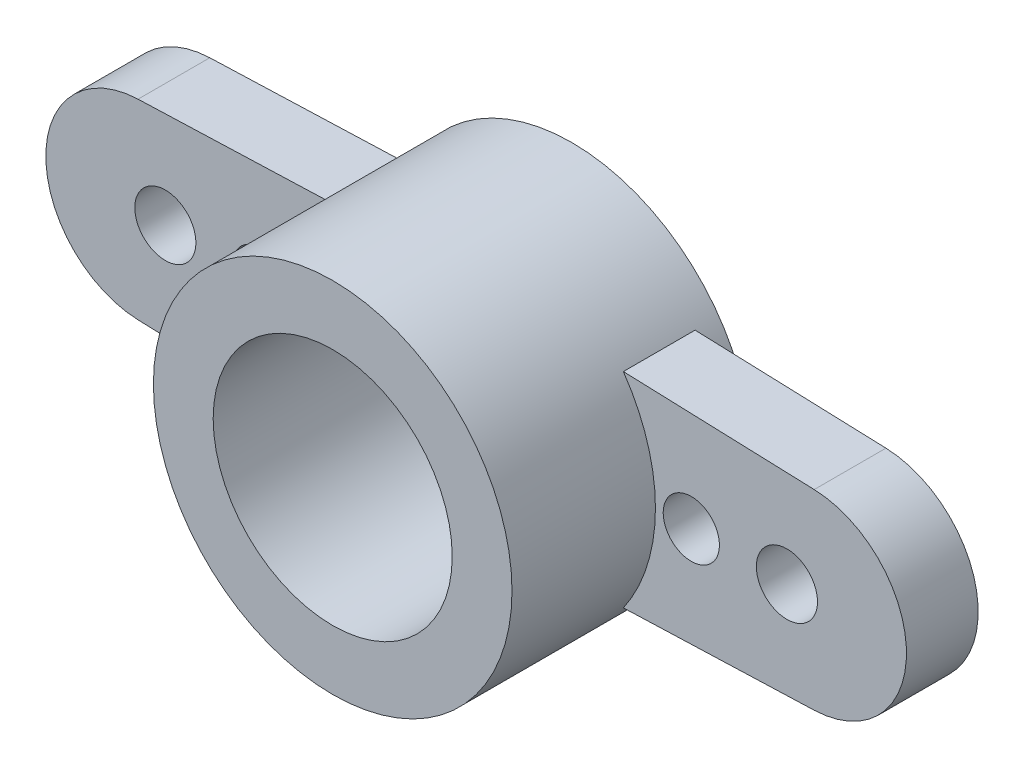
ISO-10303-21;
HEADER;
FILE_DESCRIPTION(('STEP AP214'),'2;1');
FILE_NAME('part.step','',(''),(''),'','','');
FILE_SCHEMA(('AUTOMOTIVE_DESIGN { 1 0 10303 214 1 1 1 1 }'));
ENDSEC;
DATA;
#1=APPLICATION_CONTEXT('core data for automotive mechanical design processes');
#2=APPLICATION_PROTOCOL_DEFINITION('international standard','automotive_design',2000,#1);
#3=PRODUCT_CONTEXT('',#1,'mechanical');
#4=PRODUCT('Part','Part','',(#3));
#5=PRODUCT_RELATED_PRODUCT_CATEGORY('part','',(#4));
#6=PRODUCT_DEFINITION_FORMATION('','',#4);
#7=PRODUCT_DEFINITION_CONTEXT('part definition',#1,'design');
#8=PRODUCT_DEFINITION('design','',#6,#7);
#9=PRODUCT_DEFINITION_SHAPE('','',#8);
#10=(LENGTH_UNIT() NAMED_UNIT(*) SI_UNIT(.MILLI.,.METRE.));
#11=(NAMED_UNIT(*) PLANE_ANGLE_UNIT() SI_UNIT($,.RADIAN.));
#12=(NAMED_UNIT(*) SI_UNIT($,.STERADIAN.) SOLID_ANGLE_UNIT());
#13=UNCERTAINTY_MEASURE_WITH_UNIT(LENGTH_MEASURE(1.E-05),#10,'distance_accuracy_value','');
#14=(GEOMETRIC_REPRESENTATION_CONTEXT(3) GLOBAL_UNCERTAINTY_ASSIGNED_CONTEXT((#13)) GLOBAL_UNIT_ASSIGNED_CONTEXT((#10,
#11,#12)) REPRESENTATION_CONTEXT('',''));
#15=CARTESIAN_POINT('',(0.,0.,0.));
#16=DIRECTION('',(0.,0.,1.));
#17=DIRECTION('',(1.,0.,0.));
#18=AXIS2_PLACEMENT_3D('',#15,#16,#17);
#19=CARTESIAN_POINT('',(0.,0.,1.5));
#20=DIRECTION('',(0.,0.,-1.));
#21=DIRECTION('',(-1.,0.,0.));
#22=AXIS2_PLACEMENT_3D('',#19,#20,#21);
#23=CYLINDRICAL_SURFACE('',#22,3.75);
#24=DIRECTION('',(0.,0.,-1.));
#25=VECTOR('',#24,1.);
#26=CARTESIAN_POINT('',(3.07929983171955,-2.14018983886289,1.5));
#27=LINE('',#26,#25);
#28=CARTESIAN_POINT('',(3.07929983171955,-2.14018983886289,1.5));
#29=VERTEX_POINT('',#28);
#30=CARTESIAN_POINT('',(3.07929983171955,-2.14018983886289,0.));
#31=VERTEX_POINT('',#30);
#32=EDGE_CURVE('E59',#29,#31,#27,.T.);
#33=ORIENTED_EDGE('',*,*,#32,.F.);
#34=CARTESIAN_POINT('',(0.,0.,1.5));
#35=DIRECTION('',(0.,0.,1.));
#36=DIRECTION('',(-1.,0.,0.));
#37=AXIS2_PLACEMENT_3D('',#34,#35,#36);
#38=CIRCLE('',#37,3.75);
#39=CARTESIAN_POINT('',(3.07929983171955,2.14018983886289,1.5));
#40=VERTEX_POINT('',#39);
#41=EDGE_CURVE('E54',#29,#40,#38,.T.);
#42=ORIENTED_EDGE('',*,*,#41,.T.);
#43=DIRECTION('',(0.,0.,-1.));
#44=VECTOR('',#43,1.);
#45=CARTESIAN_POINT('',(3.07929983171955,2.14018983886289,1.5));
#46=LINE('',#45,#44);
#47=CARTESIAN_POINT('',(3.07929983171955,2.14018983886289,0.));
#48=VERTEX_POINT('',#47);
#49=EDGE_CURVE('E114',#40,#48,#46,.T.);
#50=ORIENTED_EDGE('',*,*,#49,.T.);
#51=CARTESIAN_POINT('',(0.,0.,0.));
#52=DIRECTION('',(0.,0.,1.));
#53=DIRECTION('',(-1.,0.,0.));
#54=AXIS2_PLACEMENT_3D('',#51,#52,#53);
#55=CIRCLE('',#54,3.75);
#56=EDGE_CURVE('E127',#31,#48,#55,.T.);
#57=ORIENTED_EDGE('',*,*,#56,.F.);
#58=EDGE_LOOP('',(#33,#42,#50,#57));
#59=FACE_BOUND('',#58,.T.);
#60=CARTESIAN_POINT('',(0.,0.,-0.5));
#61=DIRECTION('',(0.,0.,-1.));
#62=DIRECTION('',(-1.,0.,0.));
#63=AXIS2_PLACEMENT_3D('',#60,#61,#62);
#64=CIRCLE('',#63,3.75);
#65=CARTESIAN_POINT('',(-3.75,0.,-0.5));
#66=VERTEX_POINT('',#65);
#67=EDGE_CURVE('E11',#66,#66,#64,.T.);
#68=ORIENTED_EDGE('',*,*,#67,.F.);
#69=EDGE_LOOP('',(#68));
#70=FACE_BOUND('',#69,.T.);
#71=DIRECTION('',(0.,0.,-1.));
#72=VECTOR('',#71,1.);
#73=CARTESIAN_POINT('',(-3.07929983171955,-2.14018983886289,1.5));
#74=LINE('',#73,#72);
#75=CARTESIAN_POINT('',(-3.07929983171955,-2.14018983886289,1.5));
#76=VERTEX_POINT('',#75);
#77=CARTESIAN_POINT('',(-3.07929983171955,-2.14018983886289,0.));
#78=VERTEX_POINT('',#77);
#79=EDGE_CURVE('E170',#76,#78,#74,.T.);
#80=ORIENTED_EDGE('',*,*,#79,.T.);
#81=CARTESIAN_POINT('',(0.,0.,0.));
#82=DIRECTION('',(0.,0.,1.));
#83=DIRECTION('',(1.,0.,0.));
#84=AXIS2_PLACEMENT_3D('',#81,#82,#83);
#85=CIRCLE('',#84,3.75);
#86=CARTESIAN_POINT('',(-3.07929983171955,2.14018983886289,0.));
#87=VERTEX_POINT('',#86);
#88=EDGE_CURVE('E409',#87,#78,#85,.T.);
#89=ORIENTED_EDGE('',*,*,#88,.F.);
#90=DIRECTION('',(0.,0.,-1.));
#91=VECTOR('',#90,1.);
#92=CARTESIAN_POINT('',(-3.07929983171955,2.14018983886289,1.5));
#93=LINE('',#92,#91);
#94=CARTESIAN_POINT('',(-3.07929983171955,2.14018983886289,1.5));
#95=VERTEX_POINT('',#94);
#96=EDGE_CURVE('E168',#95,#87,#93,.T.);
#97=ORIENTED_EDGE('',*,*,#96,.F.);
#98=CARTESIAN_POINT('',(0.,0.,1.5));
#99=DIRECTION('',(0.,0.,1.));
#100=DIRECTION('',(1.,0.,0.));
#101=AXIS2_PLACEMENT_3D('',#98,#99,#100);
#102=CIRCLE('',#101,3.75);
#103=EDGE_CURVE('E155',#95,#76,#102,.T.);
#104=ORIENTED_EDGE('',*,*,#103,.T.);
#105=EDGE_LOOP('',(#80,#89,#97,#104));
#106=FACE_BOUND('',#105,.T.);
#107=CARTESIAN_POINT('',(0.,0.,4.5));
#108=DIRECTION('',(0.,0.,1.));
#109=DIRECTION('',(1.,0.,0.));
#110=AXIS2_PLACEMENT_3D('',#107,#108,#109);
#111=CIRCLE('',#110,3.75);
#112=CARTESIAN_POINT('',(3.75,0.,4.5));
#113=VERTEX_POINT('',#112);
#114=EDGE_CURVE('E156',#113,#113,#111,.T.);
#115=ORIENTED_EDGE('',*,*,#114,.F.);
#116=EDGE_LOOP('',(#115));
#117=FACE_BOUND('',#116,.T.);
#118=ADVANCED_FACE('F37',(#59,#70,#106,#117),#23,.T.);
#119=CARTESIAN_POINT('',(0.,0.,-0.5));
#120=DIRECTION('',(0.,0.,-1.));
#121=DIRECTION('',(-1.,0.,0.));
#122=AXIS2_PLACEMENT_3D('',#119,#120,#121);
#123=PLANE('',#122);
#124=ORIENTED_EDGE('',*,*,#67,.T.);
#125=EDGE_LOOP('',(#124));
#126=FACE_BOUND('',#125,.T.);
#127=CARTESIAN_POINT('',(0.,0.,-0.5));
#128=DIRECTION('',(0.,0.,-1.));
#129=DIRECTION('',(-1.,0.,0.));
#130=AXIS2_PLACEMENT_3D('',#127,#128,#129);
#131=CIRCLE('',#130,2.5);
#132=CARTESIAN_POINT('',(-2.5,0.,-0.5));
#133=VERTEX_POINT('',#132);
#134=EDGE_CURVE('E46',#133,#133,#131,.T.);
#135=ORIENTED_EDGE('',*,*,#134,.F.);
#136=EDGE_LOOP('',(#135));
#137=FACE_BOUND('',#136,.T.);
#138=ADVANCED_FACE('F223',(#126,#137),#123,.T.);
#139=CARTESIAN_POINT('',(0.,0.,1.5));
#140=DIRECTION('',(0.,0.,-1.));
#141=DIRECTION('',(-1.,0.,0.));
#142=AXIS2_PLACEMENT_3D('',#139,#140,#141);
#143=CYLINDRICAL_SURFACE('',#142,2.5);
#144=ORIENTED_EDGE('',*,*,#134,.T.);
#145=EDGE_LOOP('',(#144));
#146=FACE_BOUND('',#145,.T.);
#147=CARTESIAN_POINT('',(0.,0.,4.5));
#148=DIRECTION('',(0.,0.,1.));
#149=DIRECTION('',(1.,0.,0.));
#150=AXIS2_PLACEMENT_3D('',#147,#148,#149);
#151=CIRCLE('',#150,2.5);
#152=CARTESIAN_POINT('',(2.5,0.,4.5));
#153=VERTEX_POINT('',#152);
#154=EDGE_CURVE('E152',#153,#153,#151,.T.);
#155=ORIENTED_EDGE('',*,*,#154,.T.);
#156=EDGE_LOOP('',(#155));
#157=FACE_BOUND('',#156,.T.);
#158=ADVANCED_FACE('F39',(#146,#157),#143,.F.);
#159=CARTESIAN_POINT('',(0.,0.,1.5));
#160=DIRECTION('',(0.,0.,1.));
#161=DIRECTION('',(1.,0.,0.));
#162=AXIS2_PLACEMENT_3D('',#159,#160,#161);
#163=PLANE('',#162);
#164=CARTESIAN_POINT('',(-6.5,0.,1.5));
#165=DIRECTION('',(0.,0.,1.));
#166=DIRECTION('',(1.,0.,0.));
#167=AXIS2_PLACEMENT_3D('',#164,#165,#166);
#168=CIRCLE('',#167,0.638983791672923);
#169=CARTESIAN_POINT('',(-5.86101620832708,0.,1.5));
#170=VERTEX_POINT('',#169);
#171=EDGE_CURVE('E113',#170,#170,#168,.T.);
#172=ORIENTED_EDGE('',*,*,#171,.F.);
#173=EDGE_LOOP('',(#172));
#174=FACE_BOUND('',#173,.T.);
#175=CARTESIAN_POINT('',(-4.5,0.,1.5));
#176=DIRECTION('',(0.,0.,1.));
#177=DIRECTION('',(1.,0.,0.));
#178=AXIS2_PLACEMENT_3D('',#175,#176,#177);
#179=CIRCLE('',#178,0.587851578485882);
#180=CARTESIAN_POINT('',(-3.91214842151412,0.,1.5));
#181=VERTEX_POINT('',#180);
#182=EDGE_CURVE('E148',#181,#181,#179,.T.);
#183=ORIENTED_EDGE('',*,*,#182,.F.);
#184=EDGE_LOOP('',(#183));
#185=FACE_BOUND('',#184,.T.);
#186=ORIENTED_EDGE('',*,*,#103,.F.);
#187=DIRECTION('',(0.999372730394994,0.0354139201848025,0.));
#188=VECTOR('',#187,1.);
#189=CARTESIAN_POINT('',(-0.0796068605695939,2.24648740355352,1.5));
#190=LINE('',#189,#188);
#191=CARTESIAN_POINT('',(-7.07082784036961,1.99874546078999,1.5));
#192=VERTEX_POINT('',#191);
#193=EDGE_CURVE('E174',#192,#95,#190,.T.);
#194=ORIENTED_EDGE('',*,*,#193,.F.);
#195=CARTESIAN_POINT('',(-7.,0.,1.5));
#196=DIRECTION('',(0.,0.,1.));
#197=DIRECTION('',(1.,0.,0.));
#198=AXIS2_PLACEMENT_3D('',#195,#196,#197);
#199=CIRCLE('',#198,2.);
#200=CARTESIAN_POINT('',(-7.0708278403696,-1.99874546078999,1.5));
#201=VERTEX_POINT('',#200);
#202=EDGE_CURVE('E163',#201,#192,#199,.F.);
#203=ORIENTED_EDGE('',*,*,#202,.F.);
#204=DIRECTION('',(0.999372730394994,-0.0354139201848023,0.));
#205=VECTOR('',#204,1.);
#206=CARTESIAN_POINT('',(-0.0796068605695934,-2.24648740355352,1.5));
#207=LINE('',#206,#205);
#208=EDGE_CURVE('E177',#201,#76,#207,.T.);
#209=ORIENTED_EDGE('',*,*,#208,.T.);
#210=EDGE_LOOP('',(#186,#194,#203,#209));
#211=FACE_BOUND('',#210,.T.);
#212=ADVANCED_FACE('F231',(#174,#185,#211),#163,.T.);
#213=CARTESIAN_POINT('',(-7.,0.,1.5));
#214=DIRECTION('',(0.,0.,-1.));
#215=DIRECTION('',(-1.,0.,0.));
#216=AXIS2_PLACEMENT_3D('',#213,#214,#215);
#217=CYLINDRICAL_SURFACE('',#216,2.);
#218=CARTESIAN_POINT('',(-7.,0.,0.));
#219=DIRECTION('',(0.,0.,1.));
#220=DIRECTION('',(1.,0.,0.));
#221=AXIS2_PLACEMENT_3D('',#218,#219,#220);
#222=CIRCLE('',#221,2.);
#223=CARTESIAN_POINT('',(-7.0708278403696,-1.99874546078999,0.));
#224=VERTEX_POINT('',#223);
#225=CARTESIAN_POINT('',(-7.07082784036961,1.99874546078999,0.));
#226=VERTEX_POINT('',#225);
#227=EDGE_CURVE('E159',#224,#226,#222,.F.);
#228=ORIENTED_EDGE('',*,*,#227,.F.);
#229=DIRECTION('',(0.,0.,-1.));
#230=VECTOR('',#229,1.);
#231=CARTESIAN_POINT('',(-7.0708278403696,-1.99874546078999,1.5));
#232=LINE('',#231,#230);
#233=EDGE_CURVE('E182',#201,#224,#232,.T.);
#234=ORIENTED_EDGE('',*,*,#233,.F.);
#235=ORIENTED_EDGE('',*,*,#202,.T.);
#236=DIRECTION('',(0.,0.,-1.));
#237=VECTOR('',#236,1.);
#238=CARTESIAN_POINT('',(-7.07082784036961,1.99874546078999,1.5));
#239=LINE('',#238,#237);
#240=EDGE_CURVE('E171',#192,#226,#239,.T.);
#241=ORIENTED_EDGE('',*,*,#240,.T.);
#242=EDGE_LOOP('',(#228,#234,#235,#241));
#243=FACE_BOUND('',#242,.T.);
#244=ADVANCED_FACE('F233',(#243),#217,.T.);
#245=CARTESIAN_POINT('',(-0.0796068605695934,-2.24648740355352,1.5));
#246=DIRECTION('',(0.0354139201848023,0.999372730394994,0.));
#247=DIRECTION('',(-0.999372730394994,0.0354139201848023,0.));
#248=AXIS2_PLACEMENT_3D('',#245,#246,#247);
#249=PLANE('',#248);
#250=DIRECTION('',(0.999372730394994,-0.0354139201848023,0.));
#251=VECTOR('',#250,1.);
#252=CARTESIAN_POINT('',(-0.0796068605695934,-2.24648740355352,0.));
#253=LINE('',#252,#251);
#254=EDGE_CURVE('E412',#224,#78,#253,.T.);
#255=ORIENTED_EDGE('',*,*,#254,.T.);
#256=ORIENTED_EDGE('',*,*,#79,.F.);
#257=ORIENTED_EDGE('',*,*,#208,.F.);
#258=ORIENTED_EDGE('',*,*,#233,.T.);
#259=EDGE_LOOP('',(#255,#256,#257,#258));
#260=FACE_BOUND('',#259,.T.);
#261=ADVANCED_FACE('F238',(#260),#249,.F.);
#262=CARTESIAN_POINT('',(-0.0796068605695939,2.24648740355352,1.5));
#263=DIRECTION('',(-0.0354139201848025,0.999372730394994,0.));
#264=DIRECTION('',(-0.999372730394994,-0.0354139201848025,0.));
#265=AXIS2_PLACEMENT_3D('',#262,#263,#264);
#266=PLANE('',#265);
#267=DIRECTION('',(0.999372730394994,0.0354139201848025,0.));
#268=VECTOR('',#267,1.);
#269=CARTESIAN_POINT('',(-0.0796068605695939,2.24648740355352,0.));
#270=LINE('',#269,#268);
#271=EDGE_CURVE('E406',#226,#87,#270,.T.);
#272=ORIENTED_EDGE('',*,*,#271,.F.);
#273=ORIENTED_EDGE('',*,*,#240,.F.);
#274=ORIENTED_EDGE('',*,*,#193,.T.);
#275=ORIENTED_EDGE('',*,*,#96,.T.);
#276=EDGE_LOOP('',(#272,#273,#274,#275));
#277=FACE_BOUND('',#276,.T.);
#278=ADVANCED_FACE('F242',(#277),#266,.T.);
#279=CARTESIAN_POINT('',(0.,0.,0.));
#280=DIRECTION('',(0.,0.,1.));
#281=DIRECTION('',(1.,0.,0.));
#282=AXIS2_PLACEMENT_3D('',#279,#280,#281);
#283=PLANE('',#282);
#284=CARTESIAN_POINT('',(-6.5,0.,0.));
#285=DIRECTION('',(0.,0.,1.));
#286=DIRECTION('',(1.,0.,0.));
#287=AXIS2_PLACEMENT_3D('',#284,#285,#286);
#288=CIRCLE('',#287,0.638983791672923);
#289=CARTESIAN_POINT('',(-5.86101620832708,0.,0.));
#290=VERTEX_POINT('',#289);
#291=EDGE_CURVE('E147',#290,#290,#288,.T.);
#292=ORIENTED_EDGE('',*,*,#291,.T.);
#293=EDGE_LOOP('',(#292));
#294=FACE_BOUND('',#293,.T.);
#295=CARTESIAN_POINT('',(-4.5,0.,0.));
#296=DIRECTION('',(0.,0.,1.));
#297=DIRECTION('',(1.,0.,0.));
#298=AXIS2_PLACEMENT_3D('',#295,#296,#297);
#299=CIRCLE('',#298,0.587851578485882);
#300=CARTESIAN_POINT('',(-3.91214842151412,0.,0.));
#301=VERTEX_POINT('',#300);
#302=EDGE_CURVE('E151',#301,#301,#299,.T.);
#303=ORIENTED_EDGE('',*,*,#302,.T.);
#304=EDGE_LOOP('',(#303));
#305=FACE_BOUND('',#304,.T.);
#306=ORIENTED_EDGE('',*,*,#227,.T.);
#307=ORIENTED_EDGE('',*,*,#271,.T.);
#308=ORIENTED_EDGE('',*,*,#88,.T.);
#309=ORIENTED_EDGE('',*,*,#254,.F.);
#310=EDGE_LOOP('',(#306,#307,#308,#309));
#311=FACE_BOUND('',#310,.T.);
#312=ADVANCED_FACE('F246',(#294,#305,#311),#283,.F.);
#313=CARTESIAN_POINT('',(0.,0.,4.5));
#314=DIRECTION('',(0.,0.,1.));
#315=DIRECTION('',(1.,0.,0.));
#316=AXIS2_PLACEMENT_3D('',#313,#314,#315);
#317=PLANE('',#316);
#318=ORIENTED_EDGE('',*,*,#114,.T.);
#319=EDGE_LOOP('',(#318));
#320=FACE_BOUND('',#319,.T.);
#321=ORIENTED_EDGE('',*,*,#154,.F.);
#322=EDGE_LOOP('',(#321));
#323=FACE_BOUND('',#322,.T.);
#324=ADVANCED_FACE('F250',(#320,#323),#317,.T.);
#325=CARTESIAN_POINT('',(-4.5,0.,-8.5));
#326=DIRECTION('',(0.,0.,1.));
#327=DIRECTION('',(1.,0.,0.));
#328=AXIS2_PLACEMENT_3D('',#325,#326,#327);
#329=CYLINDRICAL_SURFACE('',#328,0.587851578485882);
#330=ORIENTED_EDGE('',*,*,#182,.T.);
#331=EDGE_LOOP('',(#330));
#332=FACE_BOUND('',#331,.T.);
#333=ORIENTED_EDGE('',*,*,#302,.F.);
#334=EDGE_LOOP('',(#333));
#335=FACE_BOUND('',#334,.T.);
#336=ADVANCED_FACE('F254',(#332,#335),#329,.F.);
#337=CARTESIAN_POINT('',(-6.5,0.,-8.5));
#338=DIRECTION('',(0.,0.,1.));
#339=DIRECTION('',(1.,0.,0.));
#340=AXIS2_PLACEMENT_3D('',#337,#338,#339);
#341=CYLINDRICAL_SURFACE('',#340,0.638983791672923);
#342=ORIENTED_EDGE('',*,*,#171,.T.);
#343=EDGE_LOOP('',(#342));
#344=FACE_BOUND('',#343,.T.);
#345=ORIENTED_EDGE('',*,*,#291,.F.);
#346=EDGE_LOOP('',(#345));
#347=FACE_BOUND('',#346,.T.);
#348=ADVANCED_FACE('F258',(#344,#347),#341,.F.);
#349=CARTESIAN_POINT('',(7.,0.,1.5));
#350=DIRECTION('',(0.,0.,-1.));
#351=DIRECTION('',(-1.,0.,0.));
#352=AXIS2_PLACEMENT_3D('',#349,#350,#351);
#353=CYLINDRICAL_SURFACE('',#352,2.);
#354=CARTESIAN_POINT('',(7.,0.,0.));
#355=DIRECTION('',(0.,0.,1.));
#356=DIRECTION('',(-1.,0.,0.));
#357=AXIS2_PLACEMENT_3D('',#354,#355,#356);
#358=CIRCLE('',#357,2.);
#359=CARTESIAN_POINT('',(7.0708278403696,1.99874546078999,0.));
#360=VERTEX_POINT('',#359);
#361=CARTESIAN_POINT('',(7.07082784036961,-1.99874546078999,0.));
#362=VERTEX_POINT('',#361);
#363=EDGE_CURVE('E109',#360,#362,#358,.F.);
#364=ORIENTED_EDGE('',*,*,#363,.F.);
#365=DIRECTION('',(0.,0.,-1.));
#366=VECTOR('',#365,1.);
#367=CARTESIAN_POINT('',(7.0708278403696,1.99874546078999,1.5));
#368=LINE('',#367,#366);
#369=CARTESIAN_POINT('',(7.0708278403696,1.99874546078999,1.5));
#370=VERTEX_POINT('',#369);
#371=EDGE_CURVE('E102',#370,#360,#368,.T.);
#372=ORIENTED_EDGE('',*,*,#371,.F.);
#373=CARTESIAN_POINT('',(7.,0.,1.5));
#374=DIRECTION('',(0.,0.,1.));
#375=DIRECTION('',(-1.,0.,0.));
#376=AXIS2_PLACEMENT_3D('',#373,#374,#375);
#377=CIRCLE('',#376,2.);
#378=CARTESIAN_POINT('',(7.07082784036961,-1.99874546078999,1.5));
#379=VERTEX_POINT('',#378);
#380=EDGE_CURVE('E106',#370,#379,#377,.F.);
#381=ORIENTED_EDGE('',*,*,#380,.T.);
#382=DIRECTION('',(0.,0.,-1.));
#383=VECTOR('',#382,1.);
#384=CARTESIAN_POINT('',(7.07082784036961,-1.99874546078999,1.5));
#385=LINE('',#384,#383);
#386=EDGE_CURVE('E135',#379,#362,#385,.T.);
#387=ORIENTED_EDGE('',*,*,#386,.T.);
#388=EDGE_LOOP('',(#364,#372,#381,#387));
#389=FACE_BOUND('',#388,.T.);
#390=ADVANCED_FACE('F104',(#389),#353,.T.);
#391=CARTESIAN_POINT('',(0.0796068605695934,2.24648740355352,1.5));
#392=DIRECTION('',(-0.0354139201848023,-0.999372730394994,0.));
#393=DIRECTION('',(0.999372730394994,-0.0354139201848023,0.));
#394=AXIS2_PLACEMENT_3D('',#391,#392,#393);
#395=PLANE('',#394);
#396=DIRECTION('',(-0.999372730394994,0.0354139201848023,0.));
#397=VECTOR('',#396,1.);
#398=CARTESIAN_POINT('',(0.0796068605695934,2.24648740355352,0.));
#399=LINE('',#398,#397);
#400=EDGE_CURVE('E137',#360,#48,#399,.T.);
#401=ORIENTED_EDGE('',*,*,#400,.T.);
#402=ORIENTED_EDGE('',*,*,#49,.F.);
#403=DIRECTION('',(-0.999372730394994,0.0354139201848023,0.));
#404=VECTOR('',#403,1.);
#405=CARTESIAN_POINT('',(0.0796068605695934,2.24648740355352,1.5));
#406=LINE('',#405,#404);
#407=EDGE_CURVE('E117',#370,#40,#406,.T.);
#408=ORIENTED_EDGE('',*,*,#407,.F.);
#409=ORIENTED_EDGE('',*,*,#371,.T.);
#410=EDGE_LOOP('',(#401,#402,#408,#409));
#411=FACE_BOUND('',#410,.T.);
#412=ADVANCED_FACE('F118',(#411),#395,.F.);
#413=CARTESIAN_POINT('',(0.0796068605695939,-2.24648740355352,1.5));
#414=DIRECTION('',(0.0354139201848025,-0.999372730394994,0.));
#415=DIRECTION('',(0.999372730394994,0.0354139201848025,0.));
#416=AXIS2_PLACEMENT_3D('',#413,#414,#415);
#417=PLANE('',#416);
#418=DIRECTION('',(-0.999372730394994,-0.0354139201848025,0.));
#419=VECTOR('',#418,1.);
#420=CARTESIAN_POINT('',(0.0796068605695939,-2.24648740355352,0.));
#421=LINE('',#420,#419);
#422=EDGE_CURVE('E124',#362,#31,#421,.T.);
#423=ORIENTED_EDGE('',*,*,#422,.F.);
#424=ORIENTED_EDGE('',*,*,#386,.F.);
#425=DIRECTION('',(-0.999372730394994,-0.0354139201848025,0.));
#426=VECTOR('',#425,1.);
#427=CARTESIAN_POINT('',(0.0796068605695939,-2.24648740355352,1.5));
#428=LINE('',#427,#426);
#429=EDGE_CURVE('E123',#379,#29,#428,.T.);
#430=ORIENTED_EDGE('',*,*,#429,.T.);
#431=ORIENTED_EDGE('',*,*,#32,.T.);
#432=EDGE_LOOP('',(#423,#424,#430,#431));
#433=FACE_BOUND('',#432,.T.);
#434=ADVANCED_FACE('F211',(#433),#417,.T.);
#435=CARTESIAN_POINT('',(0.,0.,1.5));
#436=DIRECTION('',(0.,0.,1.));
#437=DIRECTION('',(-1.,0.,0.));
#438=AXIS2_PLACEMENT_3D('',#435,#436,#437);
#439=PLANE('',#438);
#440=CARTESIAN_POINT('',(6.5,0.,1.5));
#441=DIRECTION('',(0.,0.,1.));
#442=DIRECTION('',(-1.,0.,0.));
#443=AXIS2_PLACEMENT_3D('',#440,#441,#442);
#444=CIRCLE('',#443,0.638983791672923);
#445=CARTESIAN_POINT('',(5.86101620832708,0.,1.5));
#446=VERTEX_POINT('',#445);
#447=EDGE_CURVE('E199',#446,#446,#444,.T.);
#448=ORIENTED_EDGE('',*,*,#447,.F.);
#449=EDGE_LOOP('',(#448));
#450=FACE_BOUND('',#449,.T.);
#451=CARTESIAN_POINT('',(4.5,0.,1.5));
#452=DIRECTION('',(0.,0.,1.));
#453=DIRECTION('',(-1.,0.,0.));
#454=AXIS2_PLACEMENT_3D('',#451,#452,#453);
#455=CIRCLE('',#454,0.587851578485882);
#456=CARTESIAN_POINT('',(3.91214842151412,0.,1.5));
#457=VERTEX_POINT('',#456);
#458=EDGE_CURVE('E130',#457,#457,#455,.T.);
#459=ORIENTED_EDGE('',*,*,#458,.F.);
#460=EDGE_LOOP('',(#459));
#461=FACE_BOUND('',#460,.T.);
#462=ORIENTED_EDGE('',*,*,#380,.F.);
#463=ORIENTED_EDGE('',*,*,#407,.T.);
#464=ORIENTED_EDGE('',*,*,#41,.F.);
#465=ORIENTED_EDGE('',*,*,#429,.F.);
#466=EDGE_LOOP('',(#462,#463,#464,#465));
#467=FACE_BOUND('',#466,.T.);
#468=ADVANCED_FACE('F121',(#450,#461,#467),#439,.T.);
#469=CARTESIAN_POINT('',(0.,0.,0.));
#470=DIRECTION('',(0.,0.,1.));
#471=DIRECTION('',(-1.,0.,0.));
#472=AXIS2_PLACEMENT_3D('',#469,#470,#471);
#473=PLANE('',#472);
#474=CARTESIAN_POINT('',(6.5,0.,0.));
#475=DIRECTION('',(0.,0.,1.));
#476=DIRECTION('',(1.,0.,0.));
#477=AXIS2_PLACEMENT_3D('',#474,#475,#476);
#478=CIRCLE('',#477,0.638983791672923);
#479=CARTESIAN_POINT('',(7.13898379167292,0.,0.));
#480=VERTEX_POINT('',#479);
#481=EDGE_CURVE('E41',#480,#480,#478,.T.);
#482=ORIENTED_EDGE('',*,*,#481,.T.);
#483=EDGE_LOOP('',(#482));
#484=FACE_BOUND('',#483,.T.);
#485=CARTESIAN_POINT('',(4.5,0.,0.));
#486=DIRECTION('',(0.,0.,1.));
#487=DIRECTION('',(1.,0.,0.));
#488=AXIS2_PLACEMENT_3D('',#485,#486,#487);
#489=CIRCLE('',#488,0.587851578485882);
#490=CARTESIAN_POINT('',(5.08785157848588,0.,0.));
#491=VERTEX_POINT('',#490);
#492=EDGE_CURVE('E138',#491,#491,#489,.T.);
#493=ORIENTED_EDGE('',*,*,#492,.T.);
#494=EDGE_LOOP('',(#493));
#495=FACE_BOUND('',#494,.T.);
#496=ORIENTED_EDGE('',*,*,#363,.T.);
#497=ORIENTED_EDGE('',*,*,#422,.T.);
#498=ORIENTED_EDGE('',*,*,#56,.T.);
#499=ORIENTED_EDGE('',*,*,#400,.F.);
#500=EDGE_LOOP('',(#496,#497,#498,#499));
#501=FACE_BOUND('',#500,.T.);
#502=ADVANCED_FACE('F210',(#484,#495,#501),#473,.F.);
#503=CARTESIAN_POINT('',(4.5,0.,-8.5));
#504=DIRECTION('',(0.,0.,1.));
#505=DIRECTION('',(1.,0.,0.));
#506=AXIS2_PLACEMENT_3D('',#503,#504,#505);
#507=CYLINDRICAL_SURFACE('',#506,0.587851578485882);
#508=ORIENTED_EDGE('',*,*,#458,.T.);
#509=EDGE_LOOP('',(#508));
#510=FACE_BOUND('',#509,.T.);
#511=ORIENTED_EDGE('',*,*,#492,.F.);
#512=EDGE_LOOP('',(#511));
#513=FACE_BOUND('',#512,.T.);
#514=ADVANCED_FACE('F217',(#510,#513),#507,.F.);
#515=CARTESIAN_POINT('',(6.5,0.,-8.5));
#516=DIRECTION('',(0.,0.,1.));
#517=DIRECTION('',(1.,0.,0.));
#518=AXIS2_PLACEMENT_3D('',#515,#516,#517);
#519=CYLINDRICAL_SURFACE('',#518,0.638983791672923);
#520=ORIENTED_EDGE('',*,*,#447,.T.);
#521=EDGE_LOOP('',(#520));
#522=FACE_BOUND('',#521,.T.);
#523=ORIENTED_EDGE('',*,*,#481,.F.);
#524=EDGE_LOOP('',(#523));
#525=FACE_BOUND('',#524,.T.);
#526=ADVANCED_FACE('F205',(#522,#525),#519,.F.);
#527=CLOSED_SHELL('',(#118,#138,#158,#212,#244,#261,#278,#312,#324,#336,#348,#390,#412,#434,
#468,#502,#514,#526));
#528=MANIFOLD_SOLID_BREP('B2',#527);
#529=ADVANCED_BREP_SHAPE_REPRESENTATION('',(#18,#528),#14);
#530=SHAPE_DEFINITION_REPRESENTATION(#9,#529);
ENDSEC;
END-ISO-10303-21;
